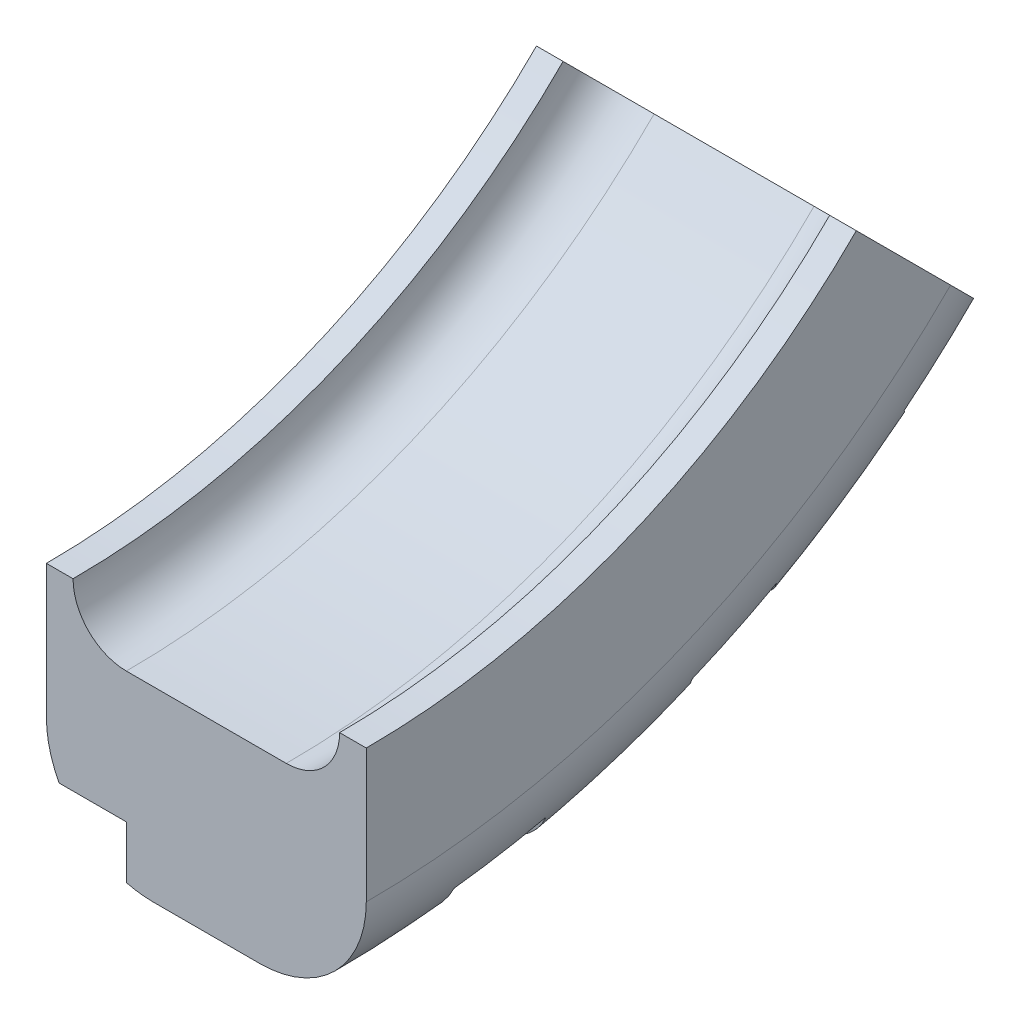
ISO-10303-21;
HEADER;
FILE_DESCRIPTION(('STEP AP214'),'2;1');
FILE_NAME('part.step','',(''),(''),'','','');
FILE_SCHEMA(('AUTOMOTIVE_DESIGN { 1 0 10303 214 1 1 1 1 }'));
ENDSEC;
DATA;
#1=APPLICATION_CONTEXT('core data for automotive mechanical design processes');
#2=APPLICATION_PROTOCOL_DEFINITION('international standard','automotive_design',2000,#1);
#3=PRODUCT_CONTEXT('',#1,'mechanical');
#4=PRODUCT('Part','Part','',(#3));
#5=PRODUCT_RELATED_PRODUCT_CATEGORY('part','',(#4));
#6=PRODUCT_DEFINITION_FORMATION('','',#4);
#7=PRODUCT_DEFINITION_CONTEXT('part definition',#1,'design');
#8=PRODUCT_DEFINITION('design','',#6,#7);
#9=PRODUCT_DEFINITION_SHAPE('','',#8);
#10=(LENGTH_UNIT() NAMED_UNIT(*) SI_UNIT(.MILLI.,.METRE.));
#11=(NAMED_UNIT(*) PLANE_ANGLE_UNIT() SI_UNIT($,.RADIAN.));
#12=(NAMED_UNIT(*) SI_UNIT($,.STERADIAN.) SOLID_ANGLE_UNIT());
#13=UNCERTAINTY_MEASURE_WITH_UNIT(LENGTH_MEASURE(1.E-05),#10,'distance_accuracy_value','');
#14=(GEOMETRIC_REPRESENTATION_CONTEXT(3) GLOBAL_UNCERTAINTY_ASSIGNED_CONTEXT((#13)) GLOBAL_UNIT_ASSIGNED_CONTEXT((#10,
#11,#12)) REPRESENTATION_CONTEXT('',''));
#15=CARTESIAN_POINT('',(0.,0.,0.));
#16=DIRECTION('',(0.,0.,1.));
#17=DIRECTION('',(1.,0.,0.));
#18=AXIS2_PLACEMENT_3D('',#15,#16,#17);
#19=CARTESIAN_POINT('',(0.352941176470576,0.,0.));
#20=DIRECTION('',(-1.,0.,0.));
#21=DIRECTION('',(0.,0.,1.));
#22=AXIS2_PLACEMENT_3D('',#19,#20,#21);
#23=CYLINDRICAL_SURFACE('',#22,26.);
#24=CARTESIAN_POINT('',(-6.,0.,0.));
#25=DIRECTION('',(-1.,0.,0.));
#26=DIRECTION('',(0.,0.,1.));
#27=AXIS2_PLACEMENT_3D('',#24,#25,#26);
#28=CIRCLE('',#27,26.);
#29=CARTESIAN_POINT('',(-6.,-18.3847763108502,-18.3847763108503));
#30=VERTEX_POINT('',#29);
#31=CARTESIAN_POINT('',(-6.,-26.,0.));
#32=VERTEX_POINT('',#31);
#33=EDGE_CURVE('E385',#30,#32,#28,.T.);
#34=ORIENTED_EDGE('',*,*,#33,.T.);
#35=DIRECTION('',(-1.,0.,0.));
#36=VECTOR('',#35,1.);
#37=CARTESIAN_POINT('',(-6.,-26.,0.));
#38=LINE('',#37,#36);
#39=CARTESIAN_POINT('',(-5.,-26.,0.));
#40=VERTEX_POINT('',#39);
#41=EDGE_CURVE('E326',#40,#32,#38,.T.);
#42=ORIENTED_EDGE('',*,*,#41,.F.);
#43=CARTESIAN_POINT('',(-5.,0.,0.));
#44=DIRECTION('',(-1.,0.,0.));
#45=DIRECTION('',(0.,0.,1.));
#46=AXIS2_PLACEMENT_3D('',#43,#44,#45);
#47=CIRCLE('',#46,26.);
#48=CARTESIAN_POINT('',(-5.,-18.3847763108502,-18.3847763108503));
#49=VERTEX_POINT('',#48);
#50=EDGE_CURVE('E387',#49,#40,#47,.T.);
#51=ORIENTED_EDGE('',*,*,#50,.F.);
#52=DIRECTION('',(-1.,0.,0.));
#53=VECTOR('',#52,1.);
#54=CARTESIAN_POINT('',(-6.,-18.3847763108502,-18.3847763108503));
#55=LINE('',#54,#53);
#56=EDGE_CURVE('E346',#49,#30,#55,.T.);
#57=ORIENTED_EDGE('',*,*,#56,.T.);
#58=EDGE_LOOP('',(#34,#42,#51,#57));
#59=FACE_BOUND('',#58,.T.);
#60=ADVANCED_FACE('F41',(#59),#23,.F.);
#61=CARTESIAN_POINT('',(-6.,-18.3847763108502,-18.3847763108503));
#62=DIRECTION('',(-1.,0.,0.));
#63=DIRECTION('',(0.,0.,1.));
#64=AXIS2_PLACEMENT_3D('',#61,#62,#63);
#65=PLANE('',#64);
#66=CARTESIAN_POINT('',(-6.,0.,0.));
#67=DIRECTION('',(-1.,0.,0.));
#68=DIRECTION('',(0.,0.,1.));
#69=AXIS2_PLACEMENT_3D('',#66,#67,#68);
#70=CIRCLE('',#69,31.);
#71=CARTESIAN_POINT('',(-6.,-21.9203102167829,-21.920310216783));
#72=VERTEX_POINT('',#71);
#73=CARTESIAN_POINT('',(-6.,-31.,0.));
#74=VERTEX_POINT('',#73);
#75=EDGE_CURVE('E383',#72,#74,#70,.T.);
#76=ORIENTED_EDGE('',*,*,#75,.T.);
#77=DIRECTION('',(0.,-1.,0.));
#78=VECTOR('',#77,1.);
#79=CARTESIAN_POINT('',(-6.,-26.,0.));
#80=LINE('',#79,#78);
#81=EDGE_CURVE('E329',#32,#74,#80,.T.);
#82=ORIENTED_EDGE('',*,*,#81,.F.);
#83=ORIENTED_EDGE('',*,*,#33,.F.);
#84=DIRECTION('',(0.,-0.707106781186546,-0.707106781186549));
#85=VECTOR('',#84,1.);
#86=CARTESIAN_POINT('',(-6.,-18.3847763108502,-18.3847763108503));
#87=LINE('',#86,#85);
#88=EDGE_CURVE('E349',#30,#72,#87,.T.);
#89=ORIENTED_EDGE('',*,*,#88,.T.);
#90=EDGE_LOOP('',(#76,#82,#83,#89));
#91=FACE_BOUND('',#90,.T.);
#92=ADVANCED_FACE('F488',(#91),#65,.T.);
#93=CARTESIAN_POINT('',(-2.,0.,0.));
#94=DIRECTION('',(-1.,0.,0.));
#95=DIRECTION('',(0.,0.,1.));
#96=AXIS2_PLACEMENT_3D('',#93,#94,#95);
#97=TOROIDAL_SURFACE('',#96,31.,4.);
#98=CARTESIAN_POINT('',(-5.51994318135961,0.,0.));
#99=DIRECTION('',(1.,0.,0.));
#100=DIRECTION('',(0.,0.,-1.));
#101=AXIS2_PLACEMENT_3D('',#98,#99,#100);
#102=CIRCLE('',#101,32.9);
#103=CARTESIAN_POINT('',(-5.51994318135961,-32.9,0.));
#104=VERTEX_POINT('',#103);
#105=CARTESIAN_POINT('',(-5.51994318135961,-32.7133000475342,-3.49999999999999));
#106=VERTEX_POINT('',#105);
#107=EDGE_CURVE('E283',#104,#106,#102,.T.);
#108=ORIENTED_EDGE('',*,*,#107,.F.);
#109=CARTESIAN_POINT('',(-2.,-31.,0.));
#110=DIRECTION('',(0.,0.,1.));
#111=DIRECTION('',(-1.,0.,0.));
#112=AXIS2_PLACEMENT_3D('',#109,#110,#111);
#113=CIRCLE('',#112,4.);
#114=EDGE_CURVE('E252',#74,#104,#113,.T.);
#115=ORIENTED_EDGE('',*,*,#114,.F.);
#116=ORIENTED_EDGE('',*,*,#75,.F.);
#117=CARTESIAN_POINT('',(-2.,-21.9203102167829,-21.920310216783));
#118=DIRECTION('',(0.,-0.707106781186549,0.707106781186546));
#119=DIRECTION('',(-1.,0.,0.));
#120=AXIS2_PLACEMENT_3D('',#117,#118,#119);
#121=CIRCLE('',#120,4.);
#122=CARTESIAN_POINT('',(-2.,-24.7487373415291,-24.7487373415292));
#123=VERTEX_POINT('',#122);
#124=EDGE_CURVE('E352',#72,#123,#121,.T.);
#125=ORIENTED_EDGE('',*,*,#124,.T.);
#126=CARTESIAN_POINT('',(-2.,0.,0.));
#127=DIRECTION('',(-1.,0.,0.));
#128=DIRECTION('',(0.,0.,1.));
#129=AXIS2_PLACEMENT_3D('',#126,#127,#128);
#130=CIRCLE('',#129,35.);
#131=CARTESIAN_POINT('',(-2.,-35.,0.));
#132=VERTEX_POINT('',#131);
#133=EDGE_CURVE('E380',#123,#132,#130,.T.);
#134=ORIENTED_EDGE('',*,*,#133,.T.);
#135=CARTESIAN_POINT('',(-3.,-34.8729833462074,0.));
#136=VERTEX_POINT('',#135);
#137=EDGE_CURVE('E331',#136,#132,#113,.T.);
#138=ORIENTED_EDGE('',*,*,#137,.F.);
#139=CARTESIAN_POINT('',(-3.,0.,0.));
#140=DIRECTION('',(1.,0.,0.));
#141=DIRECTION('',(0.,0.,-1.));
#142=AXIS2_PLACEMENT_3D('',#139,#140,#141);
#143=CIRCLE('',#142,34.8729833462074);
#144=CARTESIAN_POINT('',(-3.,-34.6750871658707,-3.70989184534122));
#145=VERTEX_POINT('',#144);
#146=EDGE_CURVE('E233',#145,#136,#143,.F.);
#147=ORIENTED_EDGE('',*,*,#146,.F.);
#148=CARTESIAN_POINT('',(-2.,-30.8240821116584,-3.29787234042553));
#149=DIRECTION('',(0.,0.106382978723404,-0.994325229408334));
#150=DIRECTION('',(0.,0.994325229408334,0.106382978723404));
#151=AXIS2_PLACEMENT_3D('',#148,#149,#150);
#152=CIRCLE('',#151,4.);
#153=EDGE_CURVE('E428',#106,#145,#152,.F.);
#154=ORIENTED_EDGE('',*,*,#153,.F.);
#155=EDGE_LOOP('',(#108,#115,#116,#125,#134,#138,#147,#154));
#156=FACE_BOUND('',#155,.T.);
#157=CARTESIAN_POINT('',(-2.,-28.909168902325,-11.1919593180482));
#158=DIRECTION('',(0.,0.361030945743489,-0.932553835558871));
#159=DIRECTION('',(0.,0.932553835558871,0.361030945743489));
#160=AXIS2_PLACEMENT_3D('',#157,#158,#159);
#161=CIRCLE('',#160,4.);
#162=CARTESIAN_POINT('',(-5.51994318135961,-30.6810211898869,-11.8779181149608));
#163=VERTEX_POINT('',#162);
#164=CARTESIAN_POINT('',(-3.,-32.5209343768864,-12.5902261583782));
#165=VERTEX_POINT('',#164);
#166=EDGE_CURVE('E425',#163,#165,#161,.F.);
#167=ORIENTED_EDGE('',*,*,#166,.F.);
#168=CARTESIAN_POINT('',(-5.51994318135961,0.,0.));
#169=DIRECTION('',(1.,0.,0.));
#170=DIRECTION('',(0.,0.,-1.));
#171=AXIS2_PLACEMENT_3D('',#168,#169,#170);
#172=CIRCLE('',#171,32.9);
#173=CARTESIAN_POINT('',(-5.51994318135961,-31.7705217432184,-8.54657523009572));
#174=VERTEX_POINT('',#173);
#175=EDGE_CURVE('E423',#174,#163,#172,.T.);
#176=ORIENTED_EDGE('',*,*,#175,.F.);
#177=CARTESIAN_POINT('',(-2.,-29.9357499708137,-8.05300401619961));
#178=DIRECTION('',(0.,-0.259774323103213,0.965669353897216));
#179=DIRECTION('',(0.,-0.965669353897216,-0.259774323103213));
#180=AXIS2_PLACEMENT_3D('',#177,#178,#179);
#181=CIRCLE('',#180,4.);
#182=CARTESIAN_POINT('',(-3.,-33.6757712964005,-9.05910564335067));
#183=VERTEX_POINT('',#182);
#184=EDGE_CURVE('E421',#183,#174,#181,.F.);
#185=ORIENTED_EDGE('',*,*,#184,.F.);
#186=CARTESIAN_POINT('',(-3.,0.,0.));
#187=DIRECTION('',(1.,0.,0.));
#188=DIRECTION('',(0.,0.,-1.));
#189=AXIS2_PLACEMENT_3D('',#186,#187,#188);
#190=CIRCLE('',#189,34.8729833462074);
#191=EDGE_CURVE('E419',#165,#183,#190,.F.);
#192=ORIENTED_EDGE('',*,*,#191,.F.);
#193=EDGE_LOOP('',(#167,#176,#185,#192));
#194=FACE_BOUND('',#193,.T.);
#195=CARTESIAN_POINT('',(-2.,-25.009314799569,-18.3175919065814));
#196=DIRECTION('',(0.,0.590890061502627,-0.806752090308678));
#197=DIRECTION('',(0.,0.806752090308678,0.590890061502627));
#198=AXIS2_PLACEMENT_3D('',#195,#196,#197);
#199=CIRCLE('',#198,4.);
#200=CARTESIAN_POINT('',(-5.51994318135961,-26.5421437711555,-19.4402830234364));
#201=VERTEX_POINT('',#200);
#202=CARTESIAN_POINT('',(-3.,-28.1338522098526,-20.6060992742206));
#203=VERTEX_POINT('',#202);
#204=EDGE_CURVE('E416',#201,#203,#199,.F.);
#205=ORIENTED_EDGE('',*,*,#204,.F.);
#206=CARTESIAN_POINT('',(-5.51994318135961,0.,0.));
#207=DIRECTION('',(1.,0.,0.));
#208=DIRECTION('',(0.,0.,-1.));
#209=AXIS2_PLACEMENT_3D('',#206,#207,#208);
#210=CIRCLE('',#209,32.9);
#211=CARTESIAN_POINT('',(-5.5199431813596,-28.4596384095024,-16.506331560961));
#212=VERTEX_POINT('',#211);
#213=EDGE_CURVE('E414',#212,#201,#210,.T.);
#214=ORIENTED_EDGE('',*,*,#213,.F.);
#215=CARTESIAN_POINT('',(-2.,-26.8160726654886,-15.5530783705103));
#216=DIRECTION('',(0.,-0.501712205500334,0.865034602112535));
#217=DIRECTION('',(0.,-0.865034602112535,-0.501712205500334));
#218=AXIS2_PLACEMENT_3D('',#215,#216,#217);
#219=CIRCLE('',#218,4.);
#220=CARTESIAN_POINT('',(-3.,-30.1663372733636,-17.4962013870021));
#221=VERTEX_POINT('',#220);
#222=EDGE_CURVE('E412',#221,#212,#219,.F.);
#223=ORIENTED_EDGE('',*,*,#222,.F.);
#224=CARTESIAN_POINT('',(-3.,0.,0.));
#225=DIRECTION('',(1.,0.,0.));
#226=DIRECTION('',(0.,0.,-1.));
#227=AXIS2_PLACEMENT_3D('',#224,#225,#226);
#228=CIRCLE('',#227,34.8729833462074);
#229=EDGE_CURVE('E236',#203,#221,#228,.F.);
#230=ORIENTED_EDGE('',*,*,#229,.F.);
#231=EDGE_LOOP('',(#205,#214,#223,#230));
#232=FACE_BOUND('',#231,.T.);
#233=ADVANCED_FACE('F485',(#156,#194,#232),#97,.T.);
#234=CARTESIAN_POINT('',(0.352941176470576,0.,0.));
#235=DIRECTION('',(-1.,0.,0.));
#236=DIRECTION('',(0.,0.,1.));
#237=AXIS2_PLACEMENT_3D('',#234,#235,#236);
#238=CYLINDRICAL_SURFACE('',#237,35.);
#239=CARTESIAN_POINT('',(2.,0.,0.));
#240=DIRECTION('',(-1.,0.,0.));
#241=DIRECTION('',(0.,0.,1.));
#242=AXIS2_PLACEMENT_3D('',#239,#240,#241);
#243=CIRCLE('',#242,35.);
#244=CARTESIAN_POINT('',(2.,-24.7487373415291,-24.7487373415292));
#245=VERTEX_POINT('',#244);
#246=CARTESIAN_POINT('',(2.,-35.,0.));
#247=VERTEX_POINT('',#246);
#248=EDGE_CURVE('E378',#245,#247,#243,.T.);
#249=ORIENTED_EDGE('',*,*,#248,.T.);
#250=DIRECTION('',(1.,0.,0.));
#251=VECTOR('',#250,1.);
#252=CARTESIAN_POINT('',(2.,-35.,0.));
#253=LINE('',#252,#251);
#254=EDGE_CURVE('E333',#132,#247,#253,.T.);
#255=ORIENTED_EDGE('',*,*,#254,.F.);
#256=ORIENTED_EDGE('',*,*,#133,.F.);
#257=DIRECTION('',(1.,0.,0.));
#258=VECTOR('',#257,1.);
#259=CARTESIAN_POINT('',(2.,-24.7487373415291,-24.7487373415292));
#260=LINE('',#259,#258);
#261=EDGE_CURVE('E355',#123,#245,#260,.T.);
#262=ORIENTED_EDGE('',*,*,#261,.T.);
#263=EDGE_LOOP('',(#249,#255,#256,#262));
#264=FACE_BOUND('',#263,.T.);
#265=ADVANCED_FACE('F482',(#264),#238,.T.);
#266=CARTESIAN_POINT('',(2.,0.,0.));
#267=DIRECTION('',(-1.,0.,0.));
#268=DIRECTION('',(0.,0.,1.));
#269=AXIS2_PLACEMENT_3D('',#266,#267,#268);
#270=TOROIDAL_SURFACE('',#269,31.,4.);
#271=CARTESIAN_POINT('',(5.51994318135961,0.,0.));
#272=DIRECTION('',(-1.,0.,0.));
#273=DIRECTION('',(0.,0.,1.));
#274=AXIS2_PLACEMENT_3D('',#271,#272,#273);
#275=CIRCLE('',#274,32.9);
#276=CARTESIAN_POINT('',(5.51994318135961,-23.2638131010374,-23.2638131010375));
#277=VERTEX_POINT('',#276);
#278=CARTESIAN_POINT('',(5.51994318135961,-25.6035410124473,-20.6608007498241));
#279=VERTEX_POINT('',#278);
#280=EDGE_CURVE('E324',#277,#279,#275,.T.);
#281=ORIENTED_EDGE('',*,*,#280,.F.);
#282=CARTESIAN_POINT('',(2.,-21.9203102167829,-21.920310216783));
#283=DIRECTION('',(0.,-0.707106781186549,0.707106781186546));
#284=DIRECTION('',(1.,0.,0.));
#285=AXIS2_PLACEMENT_3D('',#282,#283,#284);
#286=CIRCLE('',#285,4.);
#287=CARTESIAN_POINT('',(6.,-21.9203102167829,-21.920310216783));
#288=VERTEX_POINT('',#287);
#289=EDGE_CURVE('E358',#277,#288,#286,.T.);
#290=ORIENTED_EDGE('',*,*,#289,.T.);
#291=CARTESIAN_POINT('',(6.,0.,0.));
#292=DIRECTION('',(-1.,0.,0.));
#293=DIRECTION('',(0.,0.,1.));
#294=AXIS2_PLACEMENT_3D('',#291,#292,#293);
#295=CIRCLE('',#294,31.);
#296=CARTESIAN_POINT('',(6.,-31.,0.));
#297=VERTEX_POINT('',#296);
#298=EDGE_CURVE('E376',#288,#297,#295,.T.);
#299=ORIENTED_EDGE('',*,*,#298,.T.);
#300=CARTESIAN_POINT('',(2.,-31.,0.));
#301=DIRECTION('',(0.,0.,1.));
#302=DIRECTION('',(1.,0.,0.));
#303=AXIS2_PLACEMENT_3D('',#300,#301,#302);
#304=CIRCLE('',#303,4.);
#305=EDGE_CURVE('E336',#247,#297,#304,.T.);
#306=ORIENTED_EDGE('',*,*,#305,.F.);
#307=ORIENTED_EDGE('',*,*,#248,.F.);
#308=CARTESIAN_POINT('',(3.,-24.6589230043088,-24.6589230043088));
#309=VERTEX_POINT('',#308);
#310=EDGE_CURVE('E359',#245,#309,#286,.T.);
#311=ORIENTED_EDGE('',*,*,#310,.T.);
#312=CARTESIAN_POINT('',(3.,0.,0.));
#313=DIRECTION('',(-1.,0.,0.));
#314=DIRECTION('',(0.,0.,1.));
#315=AXIS2_PLACEMENT_3D('',#312,#313,#314);
#316=CIRCLE('',#315,34.8729833462074);
#317=CARTESIAN_POINT('',(3.,-27.1389622896964,-21.8998103485691));
#318=VERTEX_POINT('',#317);
#319=EDGE_CURVE('E297',#318,#309,#316,.F.);
#320=ORIENTED_EDGE('',*,*,#319,.F.);
#321=CARTESIAN_POINT('',(2.,-24.1249170634001,-19.4676238068251));
#322=DIRECTION('',(0.,-0.627987864736295,0.778223131077424));
#323=DIRECTION('',(0.,-0.778223131077424,-0.627987864736295));
#324=AXIS2_PLACEMENT_3D('',#321,#322,#323);
#325=CIRCLE('',#324,4.);
#326=EDGE_CURVE('E237',#279,#318,#325,.F.);
#327=ORIENTED_EDGE('',*,*,#326,.F.);
#328=EDGE_LOOP('',(#281,#290,#299,#306,#307,#311,#320,#327));
#329=FACE_BOUND('',#328,.T.);
#330=CARTESIAN_POINT('',(2.,-28.5888540777876,-11.9865517359651));
#331=DIRECTION('',(0.,-0.386662959224679,0.922221099283471));
#332=DIRECTION('',(0.,-0.922221099283471,-0.386662959224679));
#333=AXIS2_PLACEMENT_3D('',#330,#331,#332);
#334=CIRCLE('',#333,4.);
#335=CARTESIAN_POINT('',(5.51994318135961,-30.3410741664262,-12.721211358492));
#336=VERTEX_POINT('',#335);
#337=CARTESIAN_POINT('',(3.,-32.1606010368336,-13.4840909376376));
#338=VERTEX_POINT('',#337);
#339=EDGE_CURVE('E407',#336,#338,#334,.F.);
#340=ORIENTED_EDGE('',*,*,#339,.F.);
#341=CARTESIAN_POINT('',(5.51994318135961,0.,0.));
#342=DIRECTION('',(-1.,0.,0.));
#343=DIRECTION('',(0.,0.,1.));
#344=AXIS2_PLACEMENT_3D('',#341,#342,#343);
#345=CIRCLE('',#344,32.9);
#346=CARTESIAN_POINT('',(5.51994318135961,-28.8179795649926,-15.8724306201561));
#347=VERTEX_POINT('',#346);
#348=EDGE_CURVE('E405',#347,#336,#345,.T.);
#349=ORIENTED_EDGE('',*,*,#348,.F.);
#350=CARTESIAN_POINT('',(2.,-27.1537193469535,-14.9557856907246));
#351=DIRECTION('',(0.,0.482444699700793,-0.875926430546888));
#352=DIRECTION('',(0.,0.875926430546888,0.482444699700793));
#353=AXIS2_PLACEMENT_3D('',#350,#351,#352);
#354=CIRCLE('',#353,4.);
#355=CARTESIAN_POINT('',(3.,-30.5461678249644,-16.8242859781319));
#356=VERTEX_POINT('',#355);
#357=EDGE_CURVE('E403',#356,#347,#354,.F.);
#358=ORIENTED_EDGE('',*,*,#357,.F.);
#359=CARTESIAN_POINT('',(3.,0.,0.));
#360=DIRECTION('',(-1.,0.,0.));
#361=DIRECTION('',(0.,0.,1.));
#362=AXIS2_PLACEMENT_3D('',#359,#360,#361);
#363=CIRCLE('',#362,34.8729833462074);
#364=EDGE_CURVE('E401',#338,#356,#363,.F.);
#365=ORIENTED_EDGE('',*,*,#364,.F.);
#366=EDGE_LOOP('',(#340,#349,#358,#365));
#367=FACE_BOUND('',#366,.T.);
#368=CARTESIAN_POINT('',(2.,-30.7950399492666,-3.55886421812808));
#369=DIRECTION('',(0.,-0.114802071552519,0.993388385460214));
#370=DIRECTION('',(0.,-0.993388385460214,-0.114802071552519));
#371=AXIS2_PLACEMENT_3D('',#368,#369,#370);
#372=CIRCLE('',#371,4.);
#373=CARTESIAN_POINT('',(5.51994318135961,-32.682477881641,-3.77698815407787));
#374=VERTEX_POINT('',#373);
#375=CARTESIAN_POINT('',(3.,-34.6424166224699,-4.00349072936109));
#376=VERTEX_POINT('',#375);
#377=EDGE_CURVE('E398',#374,#376,#372,.F.);
#378=ORIENTED_EDGE('',*,*,#377,.F.);
#379=CARTESIAN_POINT('',(5.51994318135961,0.,0.));
#380=DIRECTION('',(-1.,0.,0.));
#381=DIRECTION('',(0.,0.,1.));
#382=AXIS2_PLACEMENT_3D('',#379,#380,#381);
#383=CIRCLE('',#382,32.9);
#384=CARTESIAN_POINT('',(5.51994318135961,-32.0963001303279,-7.22755269395605));
#385=VERTEX_POINT('',#384);
#386=EDGE_CURVE('E396',#385,#374,#383,.T.);
#387=ORIENTED_EDGE('',*,*,#386,.F.);
#388=CARTESIAN_POINT('',(2.,-30.2427144085157,-6.81015603381877));
#389=DIRECTION('',(0.,0.219682452703831,-0.975571432532764));
#390=DIRECTION('',(0.,0.975571432532764,0.219682452703831));
#391=AXIS2_PLACEMENT_3D('',#388,#389,#390);
#392=CIRCLE('',#391,4.);
#393=CARTESIAN_POINT('',(3.,-34.0210863197508,-7.66098251459481));
#394=VERTEX_POINT('',#393);
#395=EDGE_CURVE('E394',#394,#385,#392,.F.);
#396=ORIENTED_EDGE('',*,*,#395,.F.);
#397=CARTESIAN_POINT('',(3.,0.,0.));
#398=DIRECTION('',(-1.,0.,0.));
#399=DIRECTION('',(0.,0.,1.));
#400=AXIS2_PLACEMENT_3D('',#397,#398,#399);
#401=CIRCLE('',#400,34.8729833462074);
#402=EDGE_CURVE('E392',#376,#394,#401,.F.);
#403=ORIENTED_EDGE('',*,*,#402,.F.);
#404=EDGE_LOOP('',(#378,#387,#396,#403));
#405=FACE_BOUND('',#404,.T.);
#406=ADVANCED_FACE('F465',(#329,#367,#405),#270,.T.);
#407=CARTESIAN_POINT('',(6.,-21.9203102167829,-21.920310216783));
#408=DIRECTION('',(1.,0.,0.));
#409=DIRECTION('',(0.,0.,-1.));
#410=AXIS2_PLACEMENT_3D('',#407,#408,#409);
#411=PLANE('',#410);
#412=CARTESIAN_POINT('',(6.,0.,0.));
#413=DIRECTION('',(-1.,0.,0.));
#414=DIRECTION('',(0.,0.,1.));
#415=AXIS2_PLACEMENT_3D('',#412,#413,#414);
#416=CIRCLE('',#415,26.);
#417=CARTESIAN_POINT('',(6.,-18.3847763108502,-18.3847763108503));
#418=VERTEX_POINT('',#417);
#419=CARTESIAN_POINT('',(6.,-26.,0.));
#420=VERTEX_POINT('',#419);
#421=EDGE_CURVE('E374',#418,#420,#416,.T.);
#422=ORIENTED_EDGE('',*,*,#421,.T.);
#423=DIRECTION('',(0.,1.,0.));
#424=VECTOR('',#423,1.);
#425=CARTESIAN_POINT('',(6.,-31.,0.));
#426=LINE('',#425,#424);
#427=EDGE_CURVE('E339',#297,#420,#426,.T.);
#428=ORIENTED_EDGE('',*,*,#427,.F.);
#429=ORIENTED_EDGE('',*,*,#298,.F.);
#430=DIRECTION('',(0.,0.707106781186546,0.707106781186549));
#431=VECTOR('',#430,1.);
#432=CARTESIAN_POINT('',(6.,-21.9203102167829,-21.920310216783));
#433=LINE('',#432,#431);
#434=EDGE_CURVE('E362',#288,#418,#433,.T.);
#435=ORIENTED_EDGE('',*,*,#434,.T.);
#436=EDGE_LOOP('',(#422,#428,#429,#435));
#437=FACE_BOUND('',#436,.T.);
#438=ADVANCED_FACE('F461',(#437),#411,.T.);
#439=CARTESIAN_POINT('',(0.352941176470576,0.,0.));
#440=DIRECTION('',(-1.,0.,0.));
#441=DIRECTION('',(0.,0.,1.));
#442=AXIS2_PLACEMENT_3D('',#439,#440,#441);
#443=CYLINDRICAL_SURFACE('',#442,26.);
#444=CARTESIAN_POINT('',(5.,0.,0.));
#445=DIRECTION('',(-1.,0.,0.));
#446=DIRECTION('',(0.,0.,1.));
#447=AXIS2_PLACEMENT_3D('',#444,#445,#446);
#448=CIRCLE('',#447,26.);
#449=CARTESIAN_POINT('',(5.,-18.3847763108502,-18.3847763108503));
#450=VERTEX_POINT('',#449);
#451=CARTESIAN_POINT('',(5.,-26.,0.));
#452=VERTEX_POINT('',#451);
#453=EDGE_CURVE('E371',#450,#452,#448,.T.);
#454=ORIENTED_EDGE('',*,*,#453,.T.);
#455=DIRECTION('',(-1.,0.,0.));
#456=VECTOR('',#455,1.);
#457=CARTESIAN_POINT('',(5.,-26.,0.));
#458=LINE('',#457,#456);
#459=EDGE_CURVE('E342',#420,#452,#458,.T.);
#460=ORIENTED_EDGE('',*,*,#459,.F.);
#461=ORIENTED_EDGE('',*,*,#421,.F.);
#462=DIRECTION('',(-1.,0.,0.));
#463=VECTOR('',#462,1.);
#464=CARTESIAN_POINT('',(5.,-18.3847763108502,-18.3847763108503));
#465=LINE('',#464,#463);
#466=EDGE_CURVE('E365',#418,#450,#465,.T.);
#467=ORIENTED_EDGE('',*,*,#466,.T.);
#468=EDGE_LOOP('',(#454,#460,#461,#467));
#469=FACE_BOUND('',#468,.T.);
#470=ADVANCED_FACE('F456',(#469),#443,.F.);
#471=CARTESIAN_POINT('',(0.352941176470576,0.,0.));
#472=DIRECTION('',(-1.,0.,0.));
#473=DIRECTION('',(0.,0.,1.));
#474=AXIS2_PLACEMENT_3D('',#471,#472,#473);
#475=CYLINDRICAL_SURFACE('',#474,28.);
#476=DIRECTION('',(-1.,0.,0.));
#477=VECTOR('',#476,1.);
#478=CARTESIAN_POINT('',(-5.,-28.,0.));
#479=LINE('',#478,#477);
#480=CARTESIAN_POINT('',(3.,-28.,0.));
#481=VERTEX_POINT('',#480);
#482=CARTESIAN_POINT('',(-3.,-28.,0.));
#483=VERTEX_POINT('',#482);
#484=EDGE_CURVE('E344',#481,#483,#479,.T.);
#485=ORIENTED_EDGE('',*,*,#484,.F.);
#486=CARTESIAN_POINT('',(3.,0.,0.));
#487=DIRECTION('',(-1.,0.,0.));
#488=DIRECTION('',(0.,0.,1.));
#489=AXIS2_PLACEMENT_3D('',#486,#487,#488);
#490=CIRCLE('',#489,28.);
#491=CARTESIAN_POINT('',(3.,-19.7989898732233,-19.7989898732234));
#492=VERTEX_POINT('',#491);
#493=EDGE_CURVE('E432',#481,#492,#490,.F.);
#494=ORIENTED_EDGE('',*,*,#493,.T.);
#495=DIRECTION('',(-1.,0.,0.));
#496=VECTOR('',#495,1.);
#497=CARTESIAN_POINT('',(-5.,-19.7989898732233,-19.7989898732234));
#498=LINE('',#497,#496);
#499=CARTESIAN_POINT('',(-3.,-19.7989898732233,-19.7989898732234));
#500=VERTEX_POINT('',#499);
#501=EDGE_CURVE('E368',#492,#500,#498,.T.);
#502=ORIENTED_EDGE('',*,*,#501,.T.);
#503=CARTESIAN_POINT('',(-3.,0.,0.));
#504=DIRECTION('',(1.,0.,0.));
#505=DIRECTION('',(0.,0.,-1.));
#506=AXIS2_PLACEMENT_3D('',#503,#504,#505);
#507=CIRCLE('',#506,28.);
#508=EDGE_CURVE('E430',#500,#483,#507,.F.);
#509=ORIENTED_EDGE('',*,*,#508,.T.);
#510=EDGE_LOOP('',(#485,#494,#502,#509));
#511=FACE_BOUND('',#510,.T.);
#512=ADVANCED_FACE('F448',(#511),#475,.F.);
#513=CARTESIAN_POINT('',(2.,-21.9203102167829,-21.920310216783));
#514=DIRECTION('',(0.,-0.707106781186549,0.707106781186546));
#515=DIRECTION('',(1.,0.,0.));
#516=AXIS2_PLACEMENT_3D('',#513,#514,#515);
#517=PLANE('',#516);
#518=ORIENTED_EDGE('',*,*,#289,.F.);
#519=DIRECTION('',(1.,0.,0.));
#520=VECTOR('',#519,1.);
#521=CARTESIAN_POINT('',(3.,-23.2638131010374,-23.2638131010375));
#522=LINE('',#521,#520);
#523=CARTESIAN_POINT('',(3.,-23.2638131010374,-23.2638131010375));
#524=VERTEX_POINT('',#523);
#525=EDGE_CURVE('E293',#524,#277,#522,.T.);
#526=ORIENTED_EDGE('',*,*,#525,.F.);
#527=DIRECTION('',(0.,-0.707106781186546,-0.707106781186549));
#528=VECTOR('',#527,1.);
#529=CARTESIAN_POINT('',(3.,-21.9203102167829,-21.920310216783));
#530=LINE('',#529,#528);
#531=EDGE_CURVE('E389',#524,#309,#530,.T.);
#532=ORIENTED_EDGE('',*,*,#531,.T.);
#533=ORIENTED_EDGE('',*,*,#310,.F.);
#534=ORIENTED_EDGE('',*,*,#261,.F.);
#535=ORIENTED_EDGE('',*,*,#124,.F.);
#536=ORIENTED_EDGE('',*,*,#88,.F.);
#537=ORIENTED_EDGE('',*,*,#56,.F.);
#538=CARTESIAN_POINT('',(-3.,-18.3847763108502,-18.3847763108503));
#539=DIRECTION('',(0.,-0.707106781186549,0.707106781186546));
#540=DIRECTION('',(0.,-0.707106781186546,-0.707106781186549));
#541=AXIS2_PLACEMENT_3D('',#538,#539,#540);
#542=CIRCLE('',#541,2.);
#543=EDGE_CURVE('E11',#49,#500,#542,.T.);
#544=ORIENTED_EDGE('',*,*,#543,.T.);
#545=ORIENTED_EDGE('',*,*,#501,.F.);
#546=CARTESIAN_POINT('',(3.,-18.3847763108502,-18.3847763108503));
#547=DIRECTION('',(0.,-0.707106781186549,0.707106781186546));
#548=DIRECTION('',(0.,-0.707106781186546,-0.707106781186549));
#549=AXIS2_PLACEMENT_3D('',#546,#547,#548);
#550=CIRCLE('',#549,2.);
#551=EDGE_CURVE('E435',#492,#450,#550,.T.);
#552=ORIENTED_EDGE('',*,*,#551,.T.);
#553=ORIENTED_EDGE('',*,*,#466,.F.);
#554=ORIENTED_EDGE('',*,*,#434,.F.);
#555=EDGE_LOOP('',(#518,#526,#532,#533,#534,#535,#536,#537,#544,#545,#552,#553,#554));
#556=FACE_BOUND('',#555,.T.);
#557=ADVANCED_FACE('F444',(#556),#517,.F.);
#558=CARTESIAN_POINT('',(2.,-31.,0.));
#559=DIRECTION('',(0.,0.,1.));
#560=DIRECTION('',(1.,0.,0.));
#561=AXIS2_PLACEMENT_3D('',#558,#559,#560);
#562=PLANE('',#561);
#563=DIRECTION('',(-1.,0.,0.));
#564=VECTOR('',#563,1.);
#565=CARTESIAN_POINT('',(-3.,-32.9,0.));
#566=LINE('',#565,#564);
#567=CARTESIAN_POINT('',(-3.,-32.9,0.));
#568=VERTEX_POINT('',#567);
#569=EDGE_CURVE('E241',#568,#104,#566,.T.);
#570=ORIENTED_EDGE('',*,*,#569,.F.);
#571=DIRECTION('',(0.,1.,0.));
#572=VECTOR('',#571,1.);
#573=CARTESIAN_POINT('',(-3.,-31.,0.));
#574=LINE('',#573,#572);
#575=EDGE_CURVE('E226',#136,#568,#574,.T.);
#576=ORIENTED_EDGE('',*,*,#575,.F.);
#577=ORIENTED_EDGE('',*,*,#137,.T.);
#578=ORIENTED_EDGE('',*,*,#254,.T.);
#579=ORIENTED_EDGE('',*,*,#305,.T.);
#580=ORIENTED_EDGE('',*,*,#427,.T.);
#581=ORIENTED_EDGE('',*,*,#459,.T.);
#582=CARTESIAN_POINT('',(3.,-26.,0.));
#583=DIRECTION('',(0.,0.,1.));
#584=DIRECTION('',(1.,0.,0.));
#585=AXIS2_PLACEMENT_3D('',#582,#583,#584);
#586=CIRCLE('',#585,2.);
#587=EDGE_CURVE('E63',#452,#481,#586,.F.);
#588=ORIENTED_EDGE('',*,*,#587,.T.);
#589=ORIENTED_EDGE('',*,*,#484,.T.);
#590=CARTESIAN_POINT('',(-3.,-26.,0.));
#591=DIRECTION('',(0.,0.,1.));
#592=DIRECTION('',(1.,0.,0.));
#593=AXIS2_PLACEMENT_3D('',#590,#591,#592);
#594=CIRCLE('',#593,2.);
#595=EDGE_CURVE('E49',#483,#40,#594,.F.);
#596=ORIENTED_EDGE('',*,*,#595,.T.);
#597=ORIENTED_EDGE('',*,*,#41,.T.);
#598=ORIENTED_EDGE('',*,*,#81,.T.);
#599=ORIENTED_EDGE('',*,*,#114,.T.);
#600=EDGE_LOOP('',(#570,#576,#577,#578,#579,#580,#581,#588,#589,#596,#597,#598,#599));
#601=FACE_BOUND('',#600,.T.);
#602=ADVANCED_FACE('F249',(#601),#562,.T.);
#603=CARTESIAN_POINT('',(3.,-27.2378095877099,-21.9795752657703));
#604=DIRECTION('',(0.,-0.627987864736295,0.778223131077424));
#605=DIRECTION('',(0.,-0.778223131077424,-0.627987864736295));
#606=AXIS2_PLACEMENT_3D('',#603,#604,#605);
#607=PLANE('',#606);
#608=ORIENTED_EDGE('',*,*,#326,.T.);
#609=DIRECTION('',(0.,-0.778223131077424,-0.627987864736295));
#610=VECTOR('',#609,1.);
#611=CARTESIAN_POINT('',(3.,-27.2378095877099,-21.9795752657703));
#612=LINE('',#611,#610);
#613=CARTESIAN_POINT('',(3.,-25.6035410124473,-20.6608007498241));
#614=VERTEX_POINT('',#613);
#615=EDGE_CURVE('E289',#614,#318,#612,.T.);
#616=ORIENTED_EDGE('',*,*,#615,.F.);
#617=DIRECTION('',(1.,0.,0.));
#618=VECTOR('',#617,1.);
#619=CARTESIAN_POINT('',(3.,-25.6035410124473,-20.6608007498241));
#620=LINE('',#619,#618);
#621=EDGE_CURVE('E294',#614,#279,#620,.T.);
#622=ORIENTED_EDGE('',*,*,#621,.T.);
#623=EDGE_LOOP('',(#608,#616,#622));
#624=FACE_BOUND('',#623,.T.);
#625=ADVANCED_FACE('F475',(#624),#607,.F.);
#626=CARTESIAN_POINT('',(3.,0.,0.));
#627=DIRECTION('',(1.,0.,0.));
#628=DIRECTION('',(0.,0.,-1.));
#629=AXIS2_PLACEMENT_3D('',#626,#627,#628);
#630=CYLINDRICAL_SURFACE('',#629,32.9);
#631=ORIENTED_EDGE('',*,*,#280,.T.);
#632=ORIENTED_EDGE('',*,*,#621,.F.);
#633=CARTESIAN_POINT('',(3.,0.,0.));
#634=DIRECTION('',(-1.,0.,0.));
#635=DIRECTION('',(0.,0.,1.));
#636=AXIS2_PLACEMENT_3D('',#633,#634,#635);
#637=CIRCLE('',#636,32.9);
#638=EDGE_CURVE('E286',#524,#614,#637,.T.);
#639=ORIENTED_EDGE('',*,*,#638,.F.);
#640=ORIENTED_EDGE('',*,*,#525,.T.);
#641=EDGE_LOOP('',(#631,#632,#639,#640));
#642=FACE_BOUND('',#641,.T.);
#643=ADVANCED_FACE('F471',(#642),#630,.T.);
#644=CARTESIAN_POINT('',(3.,0.,0.));
#645=DIRECTION('',(-1.,0.,0.));
#646=DIRECTION('',(0.,0.,1.));
#647=AXIS2_PLACEMENT_3D('',#644,#645,#646);
#648=PLANE('',#647);
#649=ORIENTED_EDGE('',*,*,#319,.T.);
#650=ORIENTED_EDGE('',*,*,#531,.F.);
#651=ORIENTED_EDGE('',*,*,#638,.T.);
#652=ORIENTED_EDGE('',*,*,#615,.T.);
#653=EDGE_LOOP('',(#649,#650,#651,#652));
#654=FACE_BOUND('',#653,.T.);
#655=ADVANCED_FACE('F477',(#654),#648,.F.);
#656=CARTESIAN_POINT('',(3.,-34.7685934911075,-4.01807250433815));
#657=DIRECTION('',(0.,-0.114802071552519,0.993388385460214));
#658=DIRECTION('',(0.,-0.993388385460214,-0.114802071552519));
#659=AXIS2_PLACEMENT_3D('',#656,#657,#658);
#660=PLANE('',#659);
#661=ORIENTED_EDGE('',*,*,#377,.T.);
#662=DIRECTION('',(0.,-0.993388385460214,-0.114802071552519));
#663=VECTOR('',#662,1.);
#664=CARTESIAN_POINT('',(3.,-34.7685934911075,-4.01807250433815));
#665=LINE('',#664,#663);
#666=CARTESIAN_POINT('',(3.,-32.682477881641,-3.77698815407787));
#667=VERTEX_POINT('',#666);
#668=EDGE_CURVE('E316',#667,#376,#665,.T.);
#669=ORIENTED_EDGE('',*,*,#668,.F.);
#670=DIRECTION('',(1.,0.,0.));
#671=VECTOR('',#670,1.);
#672=CARTESIAN_POINT('',(3.,-32.682477881641,-3.77698815407787));
#673=LINE('',#672,#671);
#674=EDGE_CURVE('E302',#667,#374,#673,.T.);
#675=ORIENTED_EDGE('',*,*,#674,.T.);
#676=EDGE_LOOP('',(#661,#669,#675));
#677=FACE_BOUND('',#676,.T.);
#678=ADVANCED_FACE('F543',(#677),#660,.F.);
#679=CARTESIAN_POINT('',(3.,0.,0.));
#680=DIRECTION('',(1.,0.,0.));
#681=DIRECTION('',(0.,0.,-1.));
#682=AXIS2_PLACEMENT_3D('',#679,#680,#681);
#683=CYLINDRICAL_SURFACE('',#682,32.9);
#684=ORIENTED_EDGE('',*,*,#386,.T.);
#685=ORIENTED_EDGE('',*,*,#674,.F.);
#686=CARTESIAN_POINT('',(3.,0.,0.));
#687=DIRECTION('',(-1.,0.,0.));
#688=DIRECTION('',(0.,0.,1.));
#689=AXIS2_PLACEMENT_3D('',#686,#687,#688);
#690=CIRCLE('',#689,32.9);
#691=CARTESIAN_POINT('',(3.,-32.0963001303279,-7.22755269395616));
#692=VERTEX_POINT('',#691);
#693=EDGE_CURVE('E313',#692,#667,#690,.T.);
#694=ORIENTED_EDGE('',*,*,#693,.F.);
#695=DIRECTION('',(1.,0.,0.));
#696=VECTOR('',#695,1.);
#697=CARTESIAN_POINT('',(3.,-32.0963001303279,-7.22755269395616));
#698=LINE('',#697,#696);
#699=EDGE_CURVE('E318',#692,#385,#698,.T.);
#700=ORIENTED_EDGE('',*,*,#699,.T.);
#701=EDGE_LOOP('',(#684,#685,#694,#700));
#702=FACE_BOUND('',#701,.T.);
#703=ADVANCED_FACE('F572',(#702),#683,.T.);
#704=CARTESIAN_POINT('',(3.,-32.0963001303279,-7.22755269395616));
#705=DIRECTION('',(0.,0.219682452703831,-0.975571432532764));
#706=DIRECTION('',(0.,0.975571432532764,0.219682452703831));
#707=AXIS2_PLACEMENT_3D('',#704,#705,#706);
#708=PLANE('',#707);
#709=ORIENTED_EDGE('',*,*,#395,.T.);
#710=ORIENTED_EDGE('',*,*,#699,.F.);
#711=DIRECTION('',(0.,0.975571432532764,0.219682452703831));
#712=VECTOR('',#711,1.);
#713=CARTESIAN_POINT('',(3.,-32.0963001303279,-7.22755269395616));
#714=LINE('',#713,#712);
#715=EDGE_CURVE('E285',#394,#692,#714,.T.);
#716=ORIENTED_EDGE('',*,*,#715,.F.);
#717=EDGE_LOOP('',(#709,#710,#716));
#718=FACE_BOUND('',#717,.T.);
#719=ADVANCED_FACE('F568',(#718),#708,.F.);
#720=CARTESIAN_POINT('',(3.,0.,0.));
#721=DIRECTION('',(-1.,0.,0.));
#722=DIRECTION('',(0.,0.,1.));
#723=AXIS2_PLACEMENT_3D('',#720,#721,#722);
#724=PLANE('',#723);
#725=ORIENTED_EDGE('',*,*,#402,.T.);
#726=ORIENTED_EDGE('',*,*,#715,.T.);
#727=ORIENTED_EDGE('',*,*,#693,.T.);
#728=ORIENTED_EDGE('',*,*,#668,.T.);
#729=EDGE_LOOP('',(#725,#726,#727,#728));
#730=FACE_BOUND('',#729,.T.);
#731=ADVANCED_FACE('F558',(#730),#724,.F.);
#732=CARTESIAN_POINT('',(3.,-32.2777384749215,-13.5332035728638));
#733=DIRECTION('',(0.,-0.386662959224679,0.922221099283471));
#734=DIRECTION('',(0.,-0.922221099283471,-0.386662959224679));
#735=AXIS2_PLACEMENT_3D('',#732,#733,#734);
#736=PLANE('',#735);
#737=ORIENTED_EDGE('',*,*,#339,.T.);
#738=DIRECTION('',(0.,-0.922221099283471,-0.386662959224679));
#739=VECTOR('',#738,1.);
#740=CARTESIAN_POINT('',(3.,-32.2777384749215,-13.5332035728638));
#741=LINE('',#740,#739);
#742=CARTESIAN_POINT('',(3.,-30.3410741664262,-12.721211358492));
#743=VERTEX_POINT('',#742);
#744=EDGE_CURVE('E305',#743,#338,#741,.T.);
#745=ORIENTED_EDGE('',*,*,#744,.F.);
#746=DIRECTION('',(1.,0.,0.));
#747=VECTOR('',#746,1.);
#748=CARTESIAN_POINT('',(3.,-30.3410741664262,-12.721211358492));
#749=LINE('',#748,#747);
#750=EDGE_CURVE('E290',#743,#336,#749,.T.);
#751=ORIENTED_EDGE('',*,*,#750,.T.);
#752=EDGE_LOOP('',(#737,#745,#751));
#753=FACE_BOUND('',#752,.T.);
#754=ADVANCED_FACE('F554',(#753),#736,.F.);
#755=CARTESIAN_POINT('',(3.,0.,0.));
#756=DIRECTION('',(1.,0.,0.));
#757=DIRECTION('',(0.,0.,-1.));
#758=AXIS2_PLACEMENT_3D('',#755,#756,#757);
#759=CYLINDRICAL_SURFACE('',#758,32.9);
#760=ORIENTED_EDGE('',*,*,#348,.T.);
#761=ORIENTED_EDGE('',*,*,#750,.F.);
#762=CARTESIAN_POINT('',(3.,0.,0.));
#763=DIRECTION('',(-1.,0.,0.));
#764=DIRECTION('',(0.,0.,1.));
#765=AXIS2_PLACEMENT_3D('',#762,#763,#764);
#766=CIRCLE('',#765,32.9);
#767=CARTESIAN_POINT('',(3.,-28.8179795649925,-15.8724306201562));
#768=VERTEX_POINT('',#767);
#769=EDGE_CURVE('E301',#768,#743,#766,.T.);
#770=ORIENTED_EDGE('',*,*,#769,.F.);
#771=DIRECTION('',(1.,0.,0.));
#772=VECTOR('',#771,1.);
#773=CARTESIAN_POINT('',(3.,-28.8179795649925,-15.8724306201562));
#774=LINE('',#773,#772);
#775=EDGE_CURVE('E307',#768,#347,#774,.T.);
#776=ORIENTED_EDGE('',*,*,#775,.T.);
#777=EDGE_LOOP('',(#760,#761,#770,#776));
#778=FACE_BOUND('',#777,.T.);
#779=ADVANCED_FACE('F557',(#778),#759,.T.);
#780=CARTESIAN_POINT('',(3.,-28.8179795649925,-15.8724306201562));
#781=DIRECTION('',(0.,0.482444699700793,-0.875926430546888));
#782=DIRECTION('',(0.,0.875926430546888,0.482444699700793));
#783=AXIS2_PLACEMENT_3D('',#780,#781,#782);
#784=PLANE('',#783);
#785=ORIENTED_EDGE('',*,*,#357,.T.);
#786=ORIENTED_EDGE('',*,*,#775,.F.);
#787=DIRECTION('',(0.,0.875926430546888,0.482444699700793));
#788=VECTOR('',#787,1.);
#789=CARTESIAN_POINT('',(3.,-28.8179795649925,-15.8724306201562));
#790=LINE('',#789,#788);
#791=EDGE_CURVE('E299',#356,#768,#790,.T.);
#792=ORIENTED_EDGE('',*,*,#791,.F.);
#793=EDGE_LOOP('',(#785,#786,#792));
#794=FACE_BOUND('',#793,.T.);
#795=ADVANCED_FACE('F552',(#794),#784,.F.);
#796=CARTESIAN_POINT('',(3.,0.,0.));
#797=DIRECTION('',(-1.,0.,0.));
#798=DIRECTION('',(0.,0.,1.));
#799=AXIS2_PLACEMENT_3D('',#796,#797,#798);
#800=PLANE('',#799);
#801=ORIENTED_EDGE('',*,*,#364,.T.);
#802=ORIENTED_EDGE('',*,*,#791,.T.);
#803=ORIENTED_EDGE('',*,*,#769,.T.);
#804=ORIENTED_EDGE('',*,*,#744,.T.);
#805=EDGE_LOOP('',(#801,#802,#803,#804));
#806=FACE_BOUND('',#805,.T.);
#807=ADVANCED_FACE('F548',(#806),#800,.F.);
#808=CARTESIAN_POINT('',(-3.,-34.8013830292917,-3.72340425531915));
#809=DIRECTION('',(0.,0.106382978723404,-0.994325229408334));
#810=DIRECTION('',(0.,0.994325229408334,0.106382978723404));
#811=AXIS2_PLACEMENT_3D('',#808,#809,#810);
#812=PLANE('',#811);
#813=ORIENTED_EDGE('',*,*,#153,.T.);
#814=DIRECTION('',(0.,-0.994325229408334,-0.106382978723404));
#815=VECTOR('',#814,1.);
#816=CARTESIAN_POINT('',(-3.,-34.8013830292917,-3.72340425531915));
#817=LINE('',#816,#815);
#818=CARTESIAN_POINT('',(-3.,-32.7133000475342,-3.49999999999999));
#819=VERTEX_POINT('',#818);
#820=EDGE_CURVE('E245',#819,#145,#817,.T.);
#821=ORIENTED_EDGE('',*,*,#820,.F.);
#822=DIRECTION('',(-1.,0.,0.));
#823=VECTOR('',#822,1.);
#824=CARTESIAN_POINT('',(-3.,-32.7133000475342,-3.49999999999999));
#825=LINE('',#824,#823);
#826=EDGE_CURVE('E244',#819,#106,#825,.T.);
#827=ORIENTED_EDGE('',*,*,#826,.T.);
#828=EDGE_LOOP('',(#813,#821,#827));
#829=FACE_BOUND('',#828,.T.);
#830=ADVANCED_FACE('F551',(#829),#812,.F.);
#831=CARTESIAN_POINT('',(-3.,0.,0.));
#832=DIRECTION('',(-1.,0.,0.));
#833=DIRECTION('',(0.,0.,1.));
#834=AXIS2_PLACEMENT_3D('',#831,#832,#833);
#835=CYLINDRICAL_SURFACE('',#834,32.9);
#836=ORIENTED_EDGE('',*,*,#107,.T.);
#837=ORIENTED_EDGE('',*,*,#826,.F.);
#838=CARTESIAN_POINT('',(-3.,0.,0.));
#839=DIRECTION('',(1.,0.,0.));
#840=DIRECTION('',(0.,0.,-1.));
#841=AXIS2_PLACEMENT_3D('',#838,#839,#840);
#842=CIRCLE('',#841,32.9);
#843=EDGE_CURVE('E230',#568,#819,#842,.T.);
#844=ORIENTED_EDGE('',*,*,#843,.F.);
#845=ORIENTED_EDGE('',*,*,#569,.T.);
#846=EDGE_LOOP('',(#836,#837,#844,#845));
#847=FACE_BOUND('',#846,.T.);
#848=ADVANCED_FACE('F240',(#847),#835,.T.);
#849=CARTESIAN_POINT('',(-3.,0.,0.));
#850=DIRECTION('',(1.,0.,0.));
#851=DIRECTION('',(0.,0.,-1.));
#852=AXIS2_PLACEMENT_3D('',#849,#850,#851);
#853=PLANE('',#852);
#854=ORIENTED_EDGE('',*,*,#146,.T.);
#855=ORIENTED_EDGE('',*,*,#575,.T.);
#856=ORIENTED_EDGE('',*,*,#843,.T.);
#857=ORIENTED_EDGE('',*,*,#820,.T.);
#858=EDGE_LOOP('',(#854,#855,#856,#857));
#859=FACE_BOUND('',#858,.T.);
#860=ADVANCED_FACE('F228',(#859),#853,.F.);
#861=CARTESIAN_POINT('',(-3.,-28.2363231608037,-20.681152152592));
#862=DIRECTION('',(0.,0.590890061502627,-0.806752090308678));
#863=DIRECTION('',(0.,0.806752090308678,0.590890061502627));
#864=AXIS2_PLACEMENT_3D('',#861,#862,#863);
#865=PLANE('',#864);
#866=ORIENTED_EDGE('',*,*,#204,.T.);
#867=DIRECTION('',(0.,-0.806752090308678,-0.590890061502627));
#868=VECTOR('',#867,1.);
#869=CARTESIAN_POINT('',(-3.,-28.2363231608037,-20.681152152592));
#870=LINE('',#869,#868);
#871=CARTESIAN_POINT('',(-3.,-26.5421437711555,-19.4402830234364));
#872=VERTEX_POINT('',#871);
#873=EDGE_CURVE('E275',#872,#203,#870,.T.);
#874=ORIENTED_EDGE('',*,*,#873,.F.);
#875=DIRECTION('',(-1.,0.,0.));
#876=VECTOR('',#875,1.);
#877=CARTESIAN_POINT('',(-3.,-26.5421437711555,-19.4402830234364));
#878=LINE('',#877,#876);
#879=EDGE_CURVE('E260',#872,#201,#878,.T.);
#880=ORIENTED_EDGE('',*,*,#879,.T.);
#881=EDGE_LOOP('',(#866,#874,#880));
#882=FACE_BOUND('',#881,.T.);
#883=ADVANCED_FACE('F530',(#882),#865,.F.);
#884=CARTESIAN_POINT('',(-3.,0.,0.));
#885=DIRECTION('',(-1.,0.,0.));
#886=DIRECTION('',(0.,0.,1.));
#887=AXIS2_PLACEMENT_3D('',#884,#885,#886);
#888=CYLINDRICAL_SURFACE('',#887,32.9);
#889=ORIENTED_EDGE('',*,*,#213,.T.);
#890=ORIENTED_EDGE('',*,*,#879,.F.);
#891=CARTESIAN_POINT('',(-3.,0.,0.));
#892=DIRECTION('',(1.,0.,0.));
#893=DIRECTION('',(0.,0.,-1.));
#894=AXIS2_PLACEMENT_3D('',#891,#892,#893);
#895=CIRCLE('',#894,32.9);
#896=CARTESIAN_POINT('',(-3.,-28.4596384095024,-16.506331560961));
#897=VERTEX_POINT('',#896);
#898=EDGE_CURVE('E272',#897,#872,#895,.T.);
#899=ORIENTED_EDGE('',*,*,#898,.F.);
#900=DIRECTION('',(-1.,0.,0.));
#901=VECTOR('',#900,1.);
#902=CARTESIAN_POINT('',(-3.,-28.4596384095024,-16.506331560961));
#903=LINE('',#902,#901);
#904=EDGE_CURVE('E277',#897,#212,#903,.T.);
#905=ORIENTED_EDGE('',*,*,#904,.T.);
#906=EDGE_LOOP('',(#889,#890,#899,#905));
#907=FACE_BOUND('',#906,.T.);
#908=ADVANCED_FACE('F533',(#907),#888,.T.);
#909=CARTESIAN_POINT('',(-3.,-30.2762110739387,-17.5599271925117));
#910=DIRECTION('',(0.,-0.501712205500334,0.865034602112535));
#911=DIRECTION('',(0.,-0.865034602112535,-0.501712205500334));
#912=AXIS2_PLACEMENT_3D('',#909,#910,#911);
#913=PLANE('',#912);
#914=ORIENTED_EDGE('',*,*,#222,.T.);
#915=ORIENTED_EDGE('',*,*,#904,.F.);
#916=DIRECTION('',(0.,0.865034602112535,0.501712205500334));
#917=VECTOR('',#916,1.);
#918=CARTESIAN_POINT('',(-3.,-30.2762110739387,-17.5599271925117));
#919=LINE('',#918,#917);
#920=EDGE_CURVE('E270',#221,#897,#919,.T.);
#921=ORIENTED_EDGE('',*,*,#920,.F.);
#922=EDGE_LOOP('',(#914,#915,#921));
#923=FACE_BOUND('',#922,.T.);
#924=ADVANCED_FACE('F528',(#923),#913,.F.);
#925=CARTESIAN_POINT('',(-3.,0.,0.));
#926=DIRECTION('',(1.,0.,0.));
#927=DIRECTION('',(0.,0.,-1.));
#928=AXIS2_PLACEMENT_3D('',#925,#926,#927);
#929=PLANE('',#928);
#930=ORIENTED_EDGE('',*,*,#229,.T.);
#931=ORIENTED_EDGE('',*,*,#920,.T.);
#932=ORIENTED_EDGE('',*,*,#898,.T.);
#933=ORIENTED_EDGE('',*,*,#873,.T.);
#934=EDGE_LOOP('',(#930,#931,#932,#933));
#935=FACE_BOUND('',#934,.T.);
#936=ADVANCED_FACE('F521',(#935),#929,.F.);
#937=CARTESIAN_POINT('',(-3.,-32.6393842445605,-12.6360831010221));
#938=DIRECTION('',(0.,0.361030945743489,-0.932553835558871));
#939=DIRECTION('',(0.,0.932553835558871,0.361030945743489));
#940=AXIS2_PLACEMENT_3D('',#937,#938,#939);
#941=PLANE('',#940);
#942=ORIENTED_EDGE('',*,*,#166,.T.);
#943=DIRECTION('',(0.,-0.932553835558871,-0.361030945743489));
#944=VECTOR('',#943,1.);
#945=CARTESIAN_POINT('',(-3.,-32.6393842445605,-12.6360831010221));
#946=LINE('',#945,#944);
#947=CARTESIAN_POINT('',(-3.,-30.6810211898869,-11.8779181149608));
#948=VERTEX_POINT('',#947);
#949=EDGE_CURVE('E263',#948,#165,#946,.T.);
#950=ORIENTED_EDGE('',*,*,#949,.F.);
#951=DIRECTION('',(-1.,0.,0.));
#952=VECTOR('',#951,1.);
#953=CARTESIAN_POINT('',(-3.,-30.6810211898869,-11.8779181149608));
#954=LINE('',#953,#952);
#955=EDGE_CURVE('E246',#948,#163,#954,.T.);
#956=ORIENTED_EDGE('',*,*,#955,.T.);
#957=EDGE_LOOP('',(#942,#950,#956));
#958=FACE_BOUND('',#957,.T.);
#959=ADVANCED_FACE('F518',(#958),#941,.F.);
#960=CARTESIAN_POINT('',(-3.,0.,0.));
#961=DIRECTION('',(-1.,0.,0.));
#962=DIRECTION('',(0.,0.,1.));
#963=AXIS2_PLACEMENT_3D('',#960,#961,#962);
#964=CYLINDRICAL_SURFACE('',#963,32.9);
#965=ORIENTED_EDGE('',*,*,#175,.T.);
#966=ORIENTED_EDGE('',*,*,#955,.F.);
#967=CARTESIAN_POINT('',(-3.,0.,0.));
#968=DIRECTION('',(1.,0.,0.));
#969=DIRECTION('',(0.,0.,-1.));
#970=AXIS2_PLACEMENT_3D('',#967,#968,#969);
#971=CIRCLE('',#970,32.9);
#972=CARTESIAN_POINT('',(-3.,-31.7705217432184,-8.54657523009573));
#973=VERTEX_POINT('',#972);
#974=EDGE_CURVE('E259',#973,#948,#971,.T.);
#975=ORIENTED_EDGE('',*,*,#974,.F.);
#976=DIRECTION('',(-1.,0.,0.));
#977=VECTOR('',#976,1.);
#978=CARTESIAN_POINT('',(-3.,-31.7705217432184,-8.54657523009573));
#979=LINE('',#978,#977);
#980=EDGE_CURVE('E265',#973,#174,#979,.T.);
#981=ORIENTED_EDGE('',*,*,#980,.T.);
#982=EDGE_LOOP('',(#965,#966,#975,#981));
#983=FACE_BOUND('',#982,.T.);
#984=ADVANCED_FACE('F512',(#983),#964,.T.);
#985=CARTESIAN_POINT('',(-3.,-33.7984273864026,-9.09210130861248));
#986=DIRECTION('',(0.,-0.259774323103213,0.965669353897216));
#987=DIRECTION('',(0.,-0.965669353897216,-0.259774323103213));
#988=AXIS2_PLACEMENT_3D('',#985,#986,#987);
#989=PLANE('',#988);
#990=ORIENTED_EDGE('',*,*,#184,.T.);
#991=ORIENTED_EDGE('',*,*,#980,.F.);
#992=DIRECTION('',(0.,0.965669353897216,0.259774323103213));
#993=VECTOR('',#992,1.);
#994=CARTESIAN_POINT('',(-3.,-33.7984273864026,-9.09210130861248));
#995=LINE('',#994,#993);
#996=EDGE_CURVE('E257',#183,#973,#995,.T.);
#997=ORIENTED_EDGE('',*,*,#996,.F.);
#998=EDGE_LOOP('',(#990,#991,#997));
#999=FACE_BOUND('',#998,.T.);
#1000=ADVANCED_FACE('F506',(#999),#989,.F.);
#1001=CARTESIAN_POINT('',(-3.,0.,0.));
#1002=DIRECTION('',(1.,0.,0.));
#1003=DIRECTION('',(0.,0.,-1.));
#1004=AXIS2_PLACEMENT_3D('',#1001,#1002,#1003);
#1005=PLANE('',#1004);
#1006=ORIENTED_EDGE('',*,*,#191,.T.);
#1007=ORIENTED_EDGE('',*,*,#996,.T.);
#1008=ORIENTED_EDGE('',*,*,#974,.T.);
#1009=ORIENTED_EDGE('',*,*,#949,.T.);
#1010=EDGE_LOOP('',(#1006,#1007,#1008,#1009));
#1011=FACE_BOUND('',#1010,.T.);
#1012=ADVANCED_FACE('F500',(#1011),#1005,.F.);
#1013=CARTESIAN_POINT('',(3.,0.,0.));
#1014=DIRECTION('',(-1.,0.,0.));
#1015=DIRECTION('',(0.,0.,1.));
#1016=AXIS2_PLACEMENT_3D('',#1013,#1014,#1015);
#1017=TOROIDAL_SURFACE('',#1016,26.,2.);
#1018=ORIENTED_EDGE('',*,*,#551,.F.);
#1019=ORIENTED_EDGE('',*,*,#493,.F.);
#1020=ORIENTED_EDGE('',*,*,#587,.F.);
#1021=ORIENTED_EDGE('',*,*,#453,.F.);
#1022=EDGE_LOOP('',(#1018,#1019,#1020,#1021));
#1023=FACE_BOUND('',#1022,.T.);
#1024=ADVANCED_FACE('F451',(#1023),#1017,.F.);
#1025=CARTESIAN_POINT('',(-3.,0.,0.));
#1026=DIRECTION('',(1.,0.,0.));
#1027=DIRECTION('',(0.,0.,-1.));
#1028=AXIS2_PLACEMENT_3D('',#1025,#1026,#1027);
#1029=TOROIDAL_SURFACE('',#1028,26.,2.);
#1030=ORIENTED_EDGE('',*,*,#543,.F.);
#1031=ORIENTED_EDGE('',*,*,#50,.T.);
#1032=ORIENTED_EDGE('',*,*,#595,.F.);
#1033=ORIENTED_EDGE('',*,*,#508,.F.);
#1034=EDGE_LOOP('',(#1030,#1031,#1032,#1033));
#1035=FACE_BOUND('',#1034,.T.);
#1036=ADVANCED_FACE('F43',(#1035),#1029,.F.);
#1037=CLOSED_SHELL('',(#60,#92,#233,#265,#406,#438,#470,#512,#557,#602,#625,#643,#655,#678,#703,
#719,#731,#754,#779,#795,#807,#830,#848,#860,#883,#908,#924,#936,#959,#984,#1000,#1012,#1024,#1036));
#1038=MANIFOLD_SOLID_BREP('B2',#1037);
#1039=ADVANCED_BREP_SHAPE_REPRESENTATION('',(#18,#1038),#14);
#1040=SHAPE_DEFINITION_REPRESENTATION(#9,#1039);
ENDSEC;
END-ISO-10303-21;
